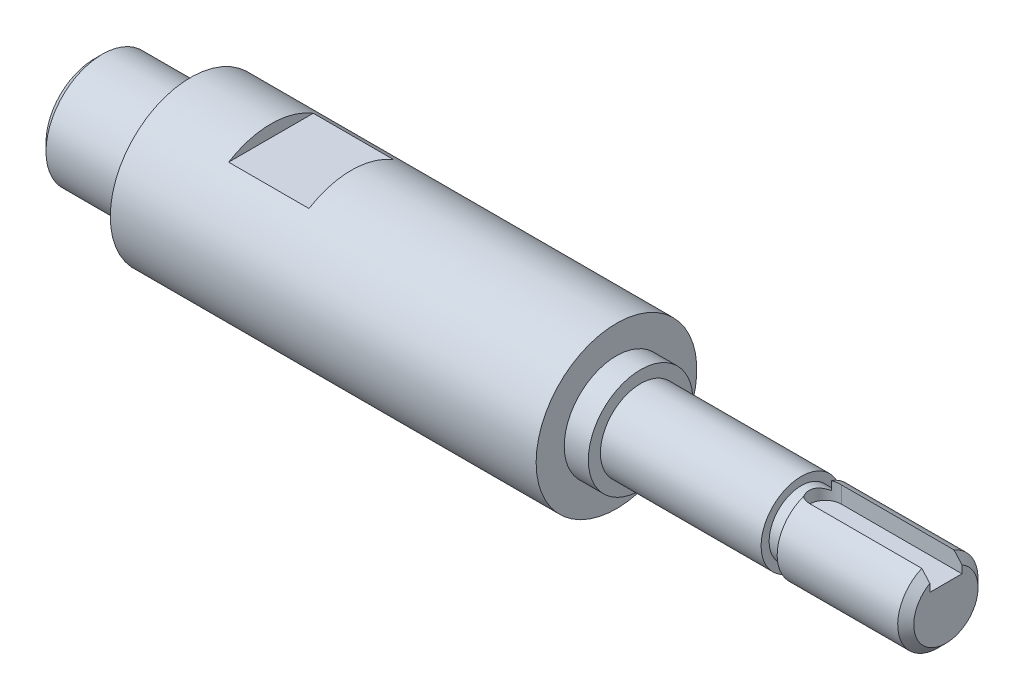
ISO-10303-21;
HEADER;
FILE_DESCRIPTION(('STEP AP214'),'2;1');
FILE_NAME('part.step','',(''),(''),'','','');
FILE_SCHEMA(('AUTOMOTIVE_DESIGN { 1 0 10303 214 1 1 1 1 }'));
ENDSEC;
DATA;
#1=APPLICATION_CONTEXT('core data for automotive mechanical design processes');
#2=APPLICATION_PROTOCOL_DEFINITION('international standard','automotive_design',2000,#1);
#3=PRODUCT_CONTEXT('',#1,'mechanical');
#4=PRODUCT('Part','Part','',(#3));
#5=PRODUCT_RELATED_PRODUCT_CATEGORY('part','',(#4));
#6=PRODUCT_DEFINITION_FORMATION('','',#4);
#7=PRODUCT_DEFINITION_CONTEXT('part definition',#1,'design');
#8=PRODUCT_DEFINITION('design','',#6,#7);
#9=PRODUCT_DEFINITION_SHAPE('','',#8);
#10=(LENGTH_UNIT() NAMED_UNIT(*) SI_UNIT(.MILLI.,.METRE.));
#11=(NAMED_UNIT(*) PLANE_ANGLE_UNIT() SI_UNIT($,.RADIAN.));
#12=(NAMED_UNIT(*) SI_UNIT($,.STERADIAN.) SOLID_ANGLE_UNIT());
#13=UNCERTAINTY_MEASURE_WITH_UNIT(LENGTH_MEASURE(1.E-05),#10,'distance_accuracy_value','');
#14=(GEOMETRIC_REPRESENTATION_CONTEXT(3) GLOBAL_UNCERTAINTY_ASSIGNED_CONTEXT((#13)) GLOBAL_UNIT_ASSIGNED_CONTEXT((#10,
#11,#12)) REPRESENTATION_CONTEXT('',''));
#15=CARTESIAN_POINT('',(0.,0.,0.));
#16=DIRECTION('',(0.,0.,1.));
#17=DIRECTION('',(1.,0.,0.));
#18=AXIS2_PLACEMENT_3D('',#15,#16,#17);
#19=CARTESIAN_POINT('',(-42.5248346383296,0.,0.));
#20=DIRECTION('',(1.,0.,0.));
#21=DIRECTION('',(0.,0.,-1.));
#22=AXIS2_PLACEMENT_3D('',#19,#20,#21);
#23=PLANE('',#22);
#24=CARTESIAN_POINT('',(-42.5248346383296,0.,0.));
#25=DIRECTION('',(1.,0.,0.));
#26=DIRECTION('',(0.,0.,-1.));
#27=AXIS2_PLACEMENT_3D('',#24,#25,#26);
#28=CIRCLE('',#27,6.00000000000002);
#29=CARTESIAN_POINT('',(-42.5248346383296,0.,-6.00000000000002));
#30=VERTEX_POINT('',#29);
#31=EDGE_CURVE('E259',#30,#30,#28,.F.);
#32=ORIENTED_EDGE('',*,*,#31,.T.);
#33=EDGE_LOOP('',(#32));
#34=FACE_BOUND('',#33,.T.);
#35=ADVANCED_FACE('F32',(#34),#23,.F.);
#36=CARTESIAN_POINT('',(-49.0671168903803,0.,0.));
#37=DIRECTION('',(-1.,0.,0.));
#38=DIRECTION('',(0.,0.,1.));
#39=AXIS2_PLACEMENT_3D('',#36,#37,#38);
#40=CYLINDRICAL_SURFACE('',#39,7.);
#41=CARTESIAN_POINT('',(-41.5248346383296,0.,0.));
#42=DIRECTION('',(1.,0.,0.));
#43=DIRECTION('',(0.,0.,-1.));
#44=AXIS2_PLACEMENT_3D('',#41,#42,#43);
#45=CIRCLE('',#44,7.);
#46=CARTESIAN_POINT('',(-41.5248346383296,0.,-7.));
#47=VERTEX_POINT('',#46);
#48=EDGE_CURVE('E256',#47,#47,#45,.T.);
#49=ORIENTED_EDGE('',*,*,#48,.T.);
#50=EDGE_LOOP('',(#49));
#51=FACE_BOUND('',#50,.T.);
#52=CARTESIAN_POINT('',(-32.5248346383296,0.,0.));
#53=DIRECTION('',(-1.,0.,0.));
#54=DIRECTION('',(0.,0.,1.));
#55=AXIS2_PLACEMENT_3D('',#52,#53,#54);
#56=CIRCLE('',#55,7.);
#57=CARTESIAN_POINT('',(-32.5248346383296,0.,7.));
#58=VERTEX_POINT('',#57);
#59=EDGE_CURVE('E265',#58,#58,#56,.T.);
#60=ORIENTED_EDGE('',*,*,#59,.T.);
#61=EDGE_LOOP('',(#60));
#62=FACE_BOUND('',#61,.T.);
#63=ADVANCED_FACE('F211',(#51,#62),#40,.T.);
#64=CARTESIAN_POINT('',(-32.5248346383296,7.,0.));
#65=DIRECTION('',(-1.,0.,0.));
#66=DIRECTION('',(0.,0.,1.));
#67=AXIS2_PLACEMENT_3D('',#64,#65,#66);
#68=PLANE('',#67);
#69=ORIENTED_EDGE('',*,*,#59,.F.);
#70=EDGE_LOOP('',(#69));
#71=FACE_BOUND('',#70,.T.);
#72=CARTESIAN_POINT('',(-32.5248346383296,0.,0.));
#73=DIRECTION('',(-1.,0.,0.));
#74=DIRECTION('',(0.,0.,1.));
#75=AXIS2_PLACEMENT_3D('',#72,#73,#74);
#76=CIRCLE('',#75,6.);
#77=CARTESIAN_POINT('',(-32.5248346383296,0.,6.));
#78=VERTEX_POINT('',#77);
#79=EDGE_CURVE('E268',#78,#78,#76,.T.);
#80=ORIENTED_EDGE('',*,*,#79,.T.);
#81=EDGE_LOOP('',(#80));
#82=FACE_BOUND('',#81,.T.);
#83=ADVANCED_FACE('F217',(#71,#82),#68,.F.);
#84=CARTESIAN_POINT('',(-49.0671168903803,0.,0.));
#85=DIRECTION('',(-1.,0.,0.));
#86=DIRECTION('',(0.,0.,1.));
#87=AXIS2_PLACEMENT_3D('',#84,#85,#86);
#88=CYLINDRICAL_SURFACE('',#87,6.);
#89=ORIENTED_EDGE('',*,*,#79,.F.);
#90=EDGE_LOOP('',(#89));
#91=FACE_BOUND('',#90,.T.);
#92=CARTESIAN_POINT('',(-30.5248346383296,0.,0.));
#93=DIRECTION('',(-1.,0.,0.));
#94=DIRECTION('',(0.,0.,1.));
#95=AXIS2_PLACEMENT_3D('',#92,#93,#94);
#96=CIRCLE('',#95,6.);
#97=CARTESIAN_POINT('',(-30.5248346383296,0.,6.));
#98=VERTEX_POINT('',#97);
#99=EDGE_CURVE('E271',#98,#98,#96,.T.);
#100=ORIENTED_EDGE('',*,*,#99,.T.);
#101=EDGE_LOOP('',(#100));
#102=FACE_BOUND('',#101,.T.);
#103=ADVANCED_FACE('F532',(#91,#102),#88,.T.);
#104=CARTESIAN_POINT('',(-30.5248346383296,6.,0.));
#105=DIRECTION('',(1.,0.,0.));
#106=DIRECTION('',(0.,0.,-1.));
#107=AXIS2_PLACEMENT_3D('',#104,#105,#106);
#108=PLANE('',#107);
#109=ORIENTED_EDGE('',*,*,#99,.F.);
#110=EDGE_LOOP('',(#109));
#111=FACE_BOUND('',#110,.T.);
#112=CARTESIAN_POINT('',(-30.5248346383296,0.,0.));
#113=DIRECTION('',(-1.,0.,0.));
#114=DIRECTION('',(0.,0.,1.));
#115=AXIS2_PLACEMENT_3D('',#112,#113,#114);
#116=CIRCLE('',#115,10.);
#117=CARTESIAN_POINT('',(-30.5248346383296,0.,10.));
#118=VERTEX_POINT('',#117);
#119=EDGE_CURVE('E274',#118,#118,#116,.T.);
#120=ORIENTED_EDGE('',*,*,#119,.T.);
#121=EDGE_LOOP('',(#120));
#122=FACE_BOUND('',#121,.T.);
#123=ADVANCED_FACE('F344',(#111,#122),#108,.F.);
#124=CARTESIAN_POINT('',(-49.0671168903803,0.,0.));
#125=DIRECTION('',(-1.,0.,0.));
#126=DIRECTION('',(0.,0.,1.));
#127=AXIS2_PLACEMENT_3D('',#124,#125,#126);
#128=CYLINDRICAL_SURFACE('',#127,10.);
#129=DIRECTION('',(-1.,0.,0.));
#130=VECTOR('',#129,1.);
#131=CARTESIAN_POINT('',(-49.0671168903803,-8.5,-5.26782687642637));
#132=LINE('',#131,#130);
#133=CARTESIAN_POINT('',(-10.5248346383296,-8.5,-5.26782687642637));
#134=VERTEX_POINT('',#133);
#135=CARTESIAN_POINT('',(-20.5248346383296,-8.5,-5.26782687642637));
#136=VERTEX_POINT('',#135);
#137=EDGE_CURVE('E235',#134,#136,#132,.T.);
#138=ORIENTED_EDGE('',*,*,#137,.T.);
#139=CARTESIAN_POINT('',(-20.5248346383296,0.,0.));
#140=DIRECTION('',(-1.,0.,0.));
#141=DIRECTION('',(0.,0.,1.));
#142=AXIS2_PLACEMENT_3D('',#139,#140,#141);
#143=CIRCLE('',#142,10.);
#144=CARTESIAN_POINT('',(-20.5248346383296,-8.5,5.26782687642637));
#145=VERTEX_POINT('',#144);
#146=EDGE_CURVE('E232',#136,#145,#143,.T.);
#147=ORIENTED_EDGE('',*,*,#146,.T.);
#148=DIRECTION('',(-1.,0.,0.));
#149=VECTOR('',#148,1.);
#150=CARTESIAN_POINT('',(-49.0671168903803,-8.5,5.26782687642637));
#151=LINE('',#150,#149);
#152=CARTESIAN_POINT('',(-10.5248346383296,-8.5,5.26782687642637));
#153=VERTEX_POINT('',#152);
#154=EDGE_CURVE('E238',#145,#153,#151,.F.);
#155=ORIENTED_EDGE('',*,*,#154,.T.);
#156=CARTESIAN_POINT('',(-10.5248346383296,0.,0.));
#157=DIRECTION('',(1.,0.,0.));
#158=DIRECTION('',(0.,1.,0.));
#159=AXIS2_PLACEMENT_3D('',#156,#157,#158);
#160=CIRCLE('',#159,10.);
#161=EDGE_CURVE('E241',#153,#134,#160,.T.);
#162=ORIENTED_EDGE('',*,*,#161,.T.);
#163=EDGE_LOOP('',(#138,#147,#155,#162));
#164=FACE_BOUND('',#163,.T.);
#165=CARTESIAN_POINT('',(-10.5248346383296,0.,0.));
#166=DIRECTION('',(1.,0.,0.));
#167=DIRECTION('',(0.,1.,0.));
#168=AXIS2_PLACEMENT_3D('',#165,#166,#167);
#169=CIRCLE('',#168,10.);
#170=CARTESIAN_POINT('',(-10.5248346383296,8.5,-5.26782687642637));
#171=VERTEX_POINT('',#170);
#172=CARTESIAN_POINT('',(-10.5248346383296,8.5,5.26782687642637));
#173=VERTEX_POINT('',#172);
#174=EDGE_CURVE('E250',#171,#173,#169,.T.);
#175=ORIENTED_EDGE('',*,*,#174,.T.);
#176=DIRECTION('',(-1.,0.,0.));
#177=VECTOR('',#176,1.);
#178=CARTESIAN_POINT('',(-49.0671168903803,8.5,5.26782687642637));
#179=LINE('',#178,#177);
#180=CARTESIAN_POINT('',(-20.5248346383296,8.5,5.26782687642637));
#181=VERTEX_POINT('',#180);
#182=EDGE_CURVE('E244',#173,#181,#179,.T.);
#183=ORIENTED_EDGE('',*,*,#182,.T.);
#184=CARTESIAN_POINT('',(-20.5248346383296,0.,0.));
#185=DIRECTION('',(-1.,0.,0.));
#186=DIRECTION('',(0.,0.,1.));
#187=AXIS2_PLACEMENT_3D('',#184,#185,#186);
#188=CIRCLE('',#187,10.);
#189=CARTESIAN_POINT('',(-20.5248346383296,8.5,-5.26782687642637));
#190=VERTEX_POINT('',#189);
#191=EDGE_CURVE('E247',#181,#190,#188,.T.);
#192=ORIENTED_EDGE('',*,*,#191,.T.);
#193=DIRECTION('',(-1.,0.,0.));
#194=VECTOR('',#193,1.);
#195=CARTESIAN_POINT('',(-49.0671168903803,8.5,-5.26782687642637));
#196=LINE('',#195,#194);
#197=EDGE_CURVE('E253',#190,#171,#196,.F.);
#198=ORIENTED_EDGE('',*,*,#197,.T.);
#199=EDGE_LOOP('',(#175,#183,#192,#198));
#200=FACE_BOUND('',#199,.T.);
#201=ORIENTED_EDGE('',*,*,#119,.F.);
#202=EDGE_LOOP('',(#201));
#203=FACE_BOUND('',#202,.T.);
#204=CARTESIAN_POINT('',(22.4751653616704,0.,0.));
#205=DIRECTION('',(-1.,0.,0.));
#206=DIRECTION('',(0.,0.,1.));
#207=AXIS2_PLACEMENT_3D('',#204,#205,#206);
#208=CIRCLE('',#207,10.);
#209=CARTESIAN_POINT('',(22.4751653616704,0.,10.));
#210=VERTEX_POINT('',#209);
#211=EDGE_CURVE('E277',#210,#210,#208,.T.);
#212=ORIENTED_EDGE('',*,*,#211,.T.);
#213=EDGE_LOOP('',(#212));
#214=FACE_BOUND('',#213,.T.);
#215=ADVANCED_FACE('F314',(#164,#200,#203,#214),#128,.T.);
#216=CARTESIAN_POINT('',(22.4751653616704,10.,0.));
#217=DIRECTION('',(-1.,0.,0.));
#218=DIRECTION('',(0.,0.,1.));
#219=AXIS2_PLACEMENT_3D('',#216,#217,#218);
#220=PLANE('',#219);
#221=ORIENTED_EDGE('',*,*,#211,.F.);
#222=EDGE_LOOP('',(#221));
#223=FACE_BOUND('',#222,.T.);
#224=CARTESIAN_POINT('',(22.4751653616704,0.,0.));
#225=DIRECTION('',(-1.,0.,0.));
#226=DIRECTION('',(0.,0.,1.));
#227=AXIS2_PLACEMENT_3D('',#224,#225,#226);
#228=CIRCLE('',#227,6.5);
#229=CARTESIAN_POINT('',(22.4751653616704,0.,6.5));
#230=VERTEX_POINT('',#229);
#231=EDGE_CURVE('E280',#230,#230,#228,.T.);
#232=ORIENTED_EDGE('',*,*,#231,.T.);
#233=EDGE_LOOP('',(#232));
#234=FACE_BOUND('',#233,.T.);
#235=ADVANCED_FACE('F343',(#223,#234),#220,.F.);
#236=CARTESIAN_POINT('',(-49.0671168903803,0.,0.));
#237=DIRECTION('',(-1.,0.,0.));
#238=DIRECTION('',(0.,0.,1.));
#239=AXIS2_PLACEMENT_3D('',#236,#237,#238);
#240=CYLINDRICAL_SURFACE('',#239,6.5);
#241=ORIENTED_EDGE('',*,*,#231,.F.);
#242=EDGE_LOOP('',(#241));
#243=FACE_BOUND('',#242,.T.);
#244=CARTESIAN_POINT('',(25.4751653616704,0.,0.));
#245=DIRECTION('',(-1.,0.,0.));
#246=DIRECTION('',(0.,0.,1.));
#247=AXIS2_PLACEMENT_3D('',#244,#245,#246);
#248=CIRCLE('',#247,6.5);
#249=CARTESIAN_POINT('',(25.4751653616704,0.,6.5));
#250=VERTEX_POINT('',#249);
#251=EDGE_CURVE('E283',#250,#250,#248,.T.);
#252=ORIENTED_EDGE('',*,*,#251,.T.);
#253=EDGE_LOOP('',(#252));
#254=FACE_BOUND('',#253,.T.);
#255=ADVANCED_FACE('F352',(#243,#254),#240,.T.);
#256=CARTESIAN_POINT('',(25.4751653616704,6.5,0.));
#257=DIRECTION('',(-1.,0.,0.));
#258=DIRECTION('',(0.,0.,1.));
#259=AXIS2_PLACEMENT_3D('',#256,#257,#258);
#260=PLANE('',#259);
#261=ORIENTED_EDGE('',*,*,#251,.F.);
#262=EDGE_LOOP('',(#261));
#263=FACE_BOUND('',#262,.T.);
#264=CARTESIAN_POINT('',(25.4751653616704,0.,0.));
#265=DIRECTION('',(-1.,0.,0.));
#266=DIRECTION('',(0.,0.,1.));
#267=AXIS2_PLACEMENT_3D('',#264,#265,#266);
#268=CIRCLE('',#267,5.);
#269=CARTESIAN_POINT('',(25.4751653616704,0.,5.));
#270=VERTEX_POINT('',#269);
#271=EDGE_CURVE('E286',#270,#270,#268,.T.);
#272=ORIENTED_EDGE('',*,*,#271,.T.);
#273=EDGE_LOOP('',(#272));
#274=FACE_BOUND('',#273,.T.);
#275=ADVANCED_FACE('F358',(#263,#274),#260,.F.);
#276=CARTESIAN_POINT('',(-49.0671168903803,0.,0.));
#277=DIRECTION('',(-1.,0.,0.));
#278=DIRECTION('',(0.,0.,1.));
#279=AXIS2_PLACEMENT_3D('',#276,#277,#278);
#280=CYLINDRICAL_SURFACE('',#279,5.);
#281=ORIENTED_EDGE('',*,*,#271,.F.);
#282=EDGE_LOOP('',(#281));
#283=FACE_BOUND('',#282,.T.);
#284=CARTESIAN_POINT('',(45.4751653616704,0.,0.));
#285=DIRECTION('',(-1.,0.,0.));
#286=DIRECTION('',(0.,0.,1.));
#287=AXIS2_PLACEMENT_3D('',#284,#285,#286);
#288=CIRCLE('',#287,5.);
#289=CARTESIAN_POINT('',(45.4751653616704,0.,5.));
#290=VERTEX_POINT('',#289);
#291=EDGE_CURVE('E289',#290,#290,#288,.T.);
#292=ORIENTED_EDGE('',*,*,#291,.T.);
#293=EDGE_LOOP('',(#292));
#294=FACE_BOUND('',#293,.T.);
#295=ADVANCED_FACE('F364',(#283,#294),#280,.T.);
#296=CARTESIAN_POINT('',(45.4751653616704,5.,0.));
#297=DIRECTION('',(-1.,0.,0.));
#298=DIRECTION('',(0.,0.,1.));
#299=AXIS2_PLACEMENT_3D('',#296,#297,#298);
#300=PLANE('',#299);
#301=ORIENTED_EDGE('',*,*,#291,.F.);
#302=EDGE_LOOP('',(#301));
#303=FACE_BOUND('',#302,.T.);
#304=CARTESIAN_POINT('',(45.4751653616704,0.,0.));
#305=DIRECTION('',(-1.,0.,0.));
#306=DIRECTION('',(0.,0.,1.));
#307=AXIS2_PLACEMENT_3D('',#304,#305,#306);
#308=CIRCLE('',#307,4.);
#309=CARTESIAN_POINT('',(45.4751653616704,0.,4.));
#310=VERTEX_POINT('',#309);
#311=EDGE_CURVE('E292',#310,#310,#308,.T.);
#312=ORIENTED_EDGE('',*,*,#311,.T.);
#313=EDGE_LOOP('',(#312));
#314=FACE_BOUND('',#313,.T.);
#315=ADVANCED_FACE('F207',(#303,#314),#300,.F.);
#316=CARTESIAN_POINT('',(-49.0671168903803,0.,0.));
#317=DIRECTION('',(-1.,0.,0.));
#318=DIRECTION('',(0.,0.,1.));
#319=AXIS2_PLACEMENT_3D('',#316,#317,#318);
#320=CYLINDRICAL_SURFACE('',#319,4.);
#321=ORIENTED_EDGE('',*,*,#311,.F.);
#322=EDGE_LOOP('',(#321));
#323=FACE_BOUND('',#322,.T.);
#324=CARTESIAN_POINT('',(47.4751653616704,0.,0.));
#325=DIRECTION('',(-1.,0.,0.));
#326=DIRECTION('',(0.,0.,1.));
#327=AXIS2_PLACEMENT_3D('',#324,#325,#326);
#328=CIRCLE('',#327,4.);
#329=CARTESIAN_POINT('',(47.4751653616704,3.60555127546399,-1.73205080756887));
#330=VERTEX_POINT('',#329);
#331=CARTESIAN_POINT('',(47.4751653616704,3.60555127546399,1.73205080756887));
#332=VERTEX_POINT('',#331);
#333=EDGE_CURVE('E295',#330,#332,#328,.T.);
#334=ORIENTED_EDGE('',*,*,#333,.T.);
#335=CARTESIAN_POINT('',(47.4751653616704,3.60555127546399,1.73205080756887));
#336=CARTESIAN_POINT('',(47.3750103685073,3.63336854411531,1.67421550653928));
#337=CARTESIAN_POINT('',(47.2803969984164,3.66343104134973,1.60801806150308));
#338=CARTESIAN_POINT('',(47.103860066441,3.72471713685452,1.46041250188742));
#339=CARTESIAN_POINT('',(47.0219703537728,3.75594356722937,1.37896504335853));
#340=CARTESIAN_POINT('',(46.8729904426494,3.81606312926052,1.20264581158777));
#341=CARTESIAN_POINT('',(46.8059082769721,3.84495498910143,1.10776679759362));
#342=CARTESIAN_POINT('',(46.688744294338,3.89724828322799,0.906752643005459));
#343=CARTESIAN_POINT('',(46.6386411802763,3.92065658416236,0.800631824263398));
#344=CARTESIAN_POINT('',(46.5591400628849,3.95853280747319,0.584429936901195));
#345=CARTESIAN_POINT('',(46.5289774331336,3.9733279107263,0.474689582013239));
#346=CARTESIAN_POINT('',(46.487704139601,3.99370388633774,0.250847724928146));
#347=CARTESIAN_POINT('',(46.4765836000015,3.99928953494885,0.136748514778659));
#348=CARTESIAN_POINT('',(46.4741264885479,4.00052065464019,-0.0805829717638436));
#349=CARTESIAN_POINT('',(46.4809737656783,3.99707864149346,-0.183794668183014));
#350=CARTESIAN_POINT('',(46.5103464237798,3.98250558376945,-0.387375703667239));
#351=CARTESIAN_POINT('',(46.5328694488868,3.97137569458334,-0.48774546747982));
#352=CARTESIAN_POINT('',(46.5922709605194,3.94266756677139,-0.681835741080993));
#353=CARTESIAN_POINT('',(46.6289818098781,3.92516476257827,-0.775619318008778));
#354=CARTESIAN_POINT('',(46.7155085466758,3.88521837494264,-0.955829572574558));
#355=CARTESIAN_POINT('',(46.7653335571682,3.86277135376557,-1.04225107306333));
#356=CARTESIAN_POINT('',(46.8814618541018,3.81273036601441,-1.21312616844123));
#357=CARTESIAN_POINT('',(46.9488047386196,3.78486126684487,-1.29679031794168));
#358=CARTESIAN_POINT('',(47.0957014568138,3.7280486995122,-1.45206104996184));
#359=CARTESIAN_POINT('',(47.1752424717932,3.69910638309688,-1.52368012657085));
#360=CARTESIAN_POINT('',(47.2942856101032,3.65970438509363,-1.61473862858372));
#361=CARTESIAN_POINT('',(47.3293523125429,3.64852280190502,-1.63980998945807));
#362=CARTESIAN_POINT('',(47.4010751031761,3.62663841211857,-1.68765591109096));
#363=CARTESIAN_POINT('',(47.4377285589571,3.61593486820076,-1.71043408205803));
#364=CARTESIAN_POINT('',(47.4751653616704,3.60555127546399,-1.73205080756888));
#365=B_SPLINE_CURVE_WITH_KNOTS('',3,(#335,#336,#337,#338,#339,#340,#341,#342,#343,#344,#345,
#346,#347,#348,#349,#350,#351,#352,#353,#354,#355,#356,#357,#358,#359,#360,#361,#362,#363,#364),
.UNSPECIFIED.,.F.,.F.,(4,2,2,2,2,2,2,2,2,2,2,2,2,2,4),(0.,0.356334863049345,0.713602038512693,
1.07106255006444,1.42807301890542,1.77044734451533,2.11264405034702,2.4216139073866,
2.73053734023873,3.03591707079167,3.34150980720075,3.67303714027957,4.00421843755681,
4.13774778666693,4.27106351827409),.UNSPECIFIED.);
#366=EDGE_CURVE('E157',#332,#330,#365,.T.);
#367=ORIENTED_EDGE('',*,*,#366,.T.);
#368=EDGE_LOOP('',(#334,#367));
#369=FACE_BOUND('',#368,.T.);
#370=ADVANCED_FACE('F166',(#323,#369),#320,.T.);
#371=CARTESIAN_POINT('',(47.4751653616704,4.,0.));
#372=DIRECTION('',(1.,0.,0.));
#373=DIRECTION('',(0.,0.,-1.));
#374=AXIS2_PLACEMENT_3D('',#371,#372,#373);
#375=PLANE('',#374);
#376=ORIENTED_EDGE('',*,*,#333,.F.);
#377=DIRECTION('',(0.,1.,0.));
#378=VECTOR('',#377,1.);
#379=CARTESIAN_POINT('',(47.4751653616704,2.5,-1.73205080756887));
#380=LINE('',#379,#378);
#381=CARTESIAN_POINT('',(47.4751653616704,4.69041575982343,-1.73205080756887));
#382=VERTEX_POINT('',#381);
#383=EDGE_CURVE('E164',#330,#382,#380,.T.);
#384=ORIENTED_EDGE('',*,*,#383,.T.);
#385=CARTESIAN_POINT('',(47.4751653616704,0.,0.));
#386=DIRECTION('',(-1.,0.,0.));
#387=DIRECTION('',(0.,0.,1.));
#388=AXIS2_PLACEMENT_3D('',#385,#386,#387);
#389=CIRCLE('',#388,5.);
#390=CARTESIAN_POINT('',(47.4751653616704,4.69041575982343,1.73205080756887));
#391=VERTEX_POINT('',#390);
#392=EDGE_CURVE('E298',#382,#391,#389,.T.);
#393=ORIENTED_EDGE('',*,*,#392,.T.);
#394=DIRECTION('',(0.,1.,0.));
#395=VECTOR('',#394,1.);
#396=CARTESIAN_POINT('',(47.4751653616704,2.5,1.73205080756887));
#397=LINE('',#396,#395);
#398=EDGE_CURVE('E154',#391,#332,#397,.F.);
#399=ORIENTED_EDGE('',*,*,#398,.T.);
#400=EDGE_LOOP('',(#376,#384,#393,#399));
#401=FACE_BOUND('',#400,.T.);
#402=ADVANCED_FACE('F198',(#401),#375,.F.);
#403=CARTESIAN_POINT('',(-49.0671168903803,0.,0.));
#404=DIRECTION('',(-1.,0.,0.));
#405=DIRECTION('',(0.,0.,1.));
#406=AXIS2_PLACEMENT_3D('',#403,#404,#405);
#407=CYLINDRICAL_SURFACE('',#406,5.);
#408=CARTESIAN_POINT('',(62.4751653616704,0.,0.));
#409=DIRECTION('',(-1.,0.,0.));
#410=DIRECTION('',(0.,0.,1.));
#411=AXIS2_PLACEMENT_3D('',#408,#409,#410);
#412=CIRCLE('',#411,5.);
#413=CARTESIAN_POINT('',(62.4751653616703,4.58257569495588,-2.));
#414=VERTEX_POINT('',#413);
#415=CARTESIAN_POINT('',(62.4751653616703,4.58257569495588,2.));
#416=VERTEX_POINT('',#415);
#417=EDGE_CURVE('E262',#414,#416,#412,.T.);
#418=ORIENTED_EDGE('',*,*,#417,.T.);
#419=DIRECTION('',(-1.,0.,0.));
#420=VECTOR('',#419,1.);
#421=CARTESIAN_POINT('',(-49.0671168903803,4.58257569495585,1.99999999999998));
#422=LINE('',#421,#420);
#423=CARTESIAN_POINT('',(48.4751653616704,4.58257569495584,2.));
#424=VERTEX_POINT('',#423);
#425=EDGE_CURVE('E150',#416,#424,#422,.T.);
#426=ORIENTED_EDGE('',*,*,#425,.T.);
#427=CARTESIAN_POINT('',(48.4751653616704,4.58257569495584,2.));
#428=CARTESIAN_POINT('',(48.4208608162929,4.5825639953333,2.00000876206649));
#429=CARTESIAN_POINT('',(48.3665609237382,4.58354061673084,1.99778864366212));
#430=CARTESIAN_POINT('',(48.2583934483385,4.58738462495646,1.98895567126682));
#431=CARTESIAN_POINT('',(48.2045258091391,4.59025176111986,1.98234339963371));
#432=CARTESIAN_POINT('',(48.0988339643383,4.59770613629191,1.96498860598102));
#433=CARTESIAN_POINT('',(48.0469910532124,4.60225321548245,1.95434237646416));
#434=CARTESIAN_POINT('',(47.9444794785598,4.61291975473362,1.92903078779727));
#435=CARTESIAN_POINT('',(47.893810531444,4.61903883064439,1.91436641050643));
#436=CARTESIAN_POINT('',(47.78004045912,4.63456666171241,1.87651904787313));
#437=CARTESIAN_POINT('',(47.7174078485079,4.6444169766245,1.85210101282848));
#438=CARTESIAN_POINT('',(47.5942536959457,4.66607360666002,1.79683920540455));
#439=CARTESIAN_POINT('',(47.5337769713418,4.67790665183955,1.76590589009467));
#440=CARTESIAN_POINT('',(47.4751653616704,4.69041575982343,1.73205080756887));
#441=B_SPLINE_CURVE_WITH_KNOTS('',3,(#427,#428,#429,#430,#431,#432,#433,#434,#435,#436,#437,
#438,#439,#440),.UNSPECIFIED.,.F.,.F.,(4,2,2,2,2,2,4),(0.,0.162852314190644,0.325683040019503,
0.484849544725888,0.643977190745887,0.847430739193429,1.05388792899364),.UNSPECIFIED.);
#442=EDGE_CURVE('E11',#424,#391,#441,.T.);
#443=ORIENTED_EDGE('',*,*,#442,.T.);
#444=ORIENTED_EDGE('',*,*,#392,.F.);
#445=CARTESIAN_POINT('',(47.4751653616704,4.69041575982343,-1.73205080756887));
#446=CARTESIAN_POINT('',(47.521444547506,4.68054920180843,-1.75876578955475));
#447=CARTESIAN_POINT('',(47.5688364737881,4.67110007132911,-1.78365650863548));
#448=CARTESIAN_POINT('',(47.6656595301554,4.65328134436455,-1.82963994017423));
#449=CARTESIAN_POINT('',(47.7150919247594,4.64491243098081,-1.8507302526589));
#450=CARTESIAN_POINT('',(47.8636502862292,4.62218337115932,-1.90710673090694));
#451=CARTESIAN_POINT('',(47.9652962953546,4.60970154401622,-1.93680044185868));
#452=CARTESIAN_POINT('',(48.1349832064461,4.59471116298902,-1.97201741298893));
#453=CARTESIAN_POINT('',(48.2018965312733,4.59022860317734,-1.98239734040735));
#454=CARTESIAN_POINT('',(48.3375684211681,4.58412740973517,-1.99644552645108));
#455=CARTESIAN_POINT('',(48.4063396092008,4.5825527461654,-2.00001076848956));
#456=CARTESIAN_POINT('',(48.4751653616704,4.58257569495584,-2.));
#457=B_SPLINE_CURVE_WITH_KNOTS('',3,(#445,#446,#447,#448,#449,#450,#451,#452,#453,#454,#455,
#456),.UNSPECIFIED.,.F.,.F.,(4,2,2,2,2,4),(0.,0.162921271260359,0.325945070178591,
0.644121500422125,0.847337056294375,1.05360102117922),.UNSPECIFIED.);
#458=CARTESIAN_POINT('',(48.4751653616704,4.58257569495585,-2.));
#459=VERTEX_POINT('',#458);
#460=EDGE_CURVE('E45',#382,#459,#457,.T.);
#461=ORIENTED_EDGE('',*,*,#460,.T.);
#462=DIRECTION('',(-1.,0.,0.));
#463=VECTOR('',#462,1.);
#464=CARTESIAN_POINT('',(-49.0671168903803,4.58257569495585,-1.99999999999998));
#465=LINE('',#464,#463);
#466=EDGE_CURVE('E147',#459,#414,#465,.F.);
#467=ORIENTED_EDGE('',*,*,#466,.T.);
#468=EDGE_LOOP('',(#418,#426,#443,#444,#461,#467));
#469=FACE_BOUND('',#468,.T.);
#470=ADVANCED_FACE('F194',(#469),#407,.T.);
#471=CARTESIAN_POINT('',(63.4751653616704,5.,0.));
#472=DIRECTION('',(-1.,0.,0.));
#473=DIRECTION('',(0.,0.,1.));
#474=AXIS2_PLACEMENT_3D('',#471,#472,#473);
#475=PLANE('',#474);
#476=DIRECTION('',(0.,0.,-1.));
#477=VECTOR('',#476,1.);
#478=CARTESIAN_POINT('',(63.4751653616704,2.5,-2.));
#479=LINE('',#478,#477);
#480=CARTESIAN_POINT('',(63.4751653616704,2.5,2.));
#481=VERTEX_POINT('',#480);
#482=CARTESIAN_POINT('',(63.4751653616704,2.5,-2.));
#483=VERTEX_POINT('',#482);
#484=EDGE_CURVE('E127',#481,#483,#479,.T.);
#485=ORIENTED_EDGE('',*,*,#484,.F.);
#486=DIRECTION('',(0.,1.,0.));
#487=VECTOR('',#486,1.);
#488=CARTESIAN_POINT('',(63.4751653616704,2.5,2.));
#489=LINE('',#488,#487);
#490=CARTESIAN_POINT('',(63.4751653616704,3.46410161513774,2.));
#491=VERTEX_POINT('',#490);
#492=EDGE_CURVE('E151',#481,#491,#489,.T.);
#493=ORIENTED_EDGE('',*,*,#492,.T.);
#494=CARTESIAN_POINT('',(63.4751653616704,0.,0.));
#495=DIRECTION('',(-1.,0.,0.));
#496=DIRECTION('',(0.,0.,1.));
#497=AXIS2_PLACEMENT_3D('',#494,#495,#496);
#498=CIRCLE('',#497,3.99999999999999);
#499=CARTESIAN_POINT('',(63.4751653616704,3.46410161513774,-2.));
#500=VERTEX_POINT('',#499);
#501=EDGE_CURVE('E140',#491,#500,#498,.F.);
#502=ORIENTED_EDGE('',*,*,#501,.T.);
#503=DIRECTION('',(0.,1.,0.));
#504=VECTOR('',#503,1.);
#505=CARTESIAN_POINT('',(63.4751653616704,2.5,-2.));
#506=LINE('',#505,#504);
#507=EDGE_CURVE('E52',#483,#500,#506,.T.);
#508=ORIENTED_EDGE('',*,*,#507,.F.);
#509=EDGE_LOOP('',(#485,#493,#502,#508));
#510=FACE_BOUND('',#509,.T.);
#511=ADVANCED_FACE('F138',(#510),#475,.F.);
#512=CARTESIAN_POINT('',(62.4751653616704,0.,0.));
#513=DIRECTION('',(-1.,0.,0.));
#514=DIRECTION('',(0.,0.,1.));
#515=AXIS2_PLACEMENT_3D('',#512,#513,#514);
#516=CONICAL_SURFACE('',#515,5.,0.785398163397446);
#517=CARTESIAN_POINT('',(59.5738189285701,7.64403528614741,2.));
#518=CARTESIAN_POINT('',(59.7293715971961,7.48323936625815,2.));
#519=CARTESIAN_POINT('',(59.8847688035972,7.32229264684007,2.));
#520=CARTESIAN_POINT('',(60.1951692609423,7.00001784510445,2.));
#521=CARTESIAN_POINT('',(60.3501725093585,6.83868976035249,2.));
#522=CARTESIAN_POINT('',(60.6597371660935,6.51553575032119,2.));
#523=CARTESIAN_POINT('',(60.8142984594542,6.35370971486206,2.));
#524=CARTESIAN_POINT('',(61.1228231900176,6.02948899953711,2.));
#525=CARTESIAN_POINT('',(61.2767866283249,5.86709432072294,2.));
#526=CARTESIAN_POINT('',(61.5863149687636,5.53909297908053,2.));
#527=CARTESIAN_POINT('',(61.741868178821,5.37347527460204,2.));
#528=CARTESIAN_POINT('',(62.05196362659,5.04129635543867,2.));
#529=CARTESIAN_POINT('',(62.2065058688193,4.8747351449763,2.));
#530=CARTESIAN_POINT('',(62.514236973166,4.54038398448662,2.));
#531=CARTESIAN_POINT('',(62.66742591512,4.37259410802584,2.));
#532=CARTESIAN_POINT('',(62.9719675234405,4.03535172445941,2.));
#533=CARTESIAN_POINT('',(63.1233201965625,3.86589922347464,2.));
#534=CARTESIAN_POINT('',(63.3734266687303,3.58150490813658,2.));
#535=CARTESIAN_POINT('',(63.4729096054335,3.46720501311768,2.));
#536=CARTESIAN_POINT('',(63.6703503288614,3.23729752659553,2.));
#537=CARTESIAN_POINT('',(63.7683081570953,3.12168997083156,2.));
#538=CARTESIAN_POINT('',(63.9617439672361,2.88933515783055,2.));
#539=CARTESIAN_POINT('',(64.0572314643665,2.77259584505813,2.));
#540=CARTESIAN_POINT('',(64.2455184794796,2.53686083541159,2.));
#541=CARTESIAN_POINT('',(64.3383166268035,2.41786403738016,2.));
#542=CARTESIAN_POINT('',(64.5207501992632,2.17599016152744,2.));
#543=CARTESIAN_POINT('',(64.6103551602504,2.05308999201208,2.));
#544=CARTESIAN_POINT('',(64.7836821891277,1.80338455618584,2.));
#545=CARTESIAN_POINT('',(64.8674122167143,1.67658492195867,2.));
#546=CARTESIAN_POINT('',(64.9866254452357,1.4817124186585,2.));
#547=CARTESIAN_POINT('',(65.0254489178725,1.41568891353058,2.));
#548=CARTESIAN_POINT('',(65.1001800852486,1.28204100039335,2.));
#549=CARTESIAN_POINT('',(65.1360890794226,1.21441732339189,2.));
#550=CARTESIAN_POINT('',(65.2044070150721,1.0769960922079,2.));
#551=CARTESIAN_POINT('',(65.2367985441046,1.00718974704244,2.));
#552=CARTESIAN_POINT('',(65.2968786055127,0.865463109435106,2.));
#553=CARTESIAN_POINT('',(65.3245595845189,0.793539634768511,2.));
#554=CARTESIAN_POINT('',(65.3493280832762,0.720544331884356,2.));
#555=B_SPLINE_CURVE_WITH_KNOTS('',3,(#517,#518,#519,#520,#521,#522,#523,#524,#525,#526,#527,
#528,#529,#530,#531,#532,#533,#534,#535,#536,#537,#538,#539,#540,#541,#542,#543,#544,#545,#546,
#547,#548,#549,#550,#551,#552,#553,#554),.UNSPECIFIED.,.F.,.F.,(4,2,2,2,2,2,2,2,2,2,2,2,2,2,2,2,
2,2,4),(0.,0.671169197199749,1.34234269037459,2.01367725008726,2.68501056888133,3.3666482727071,
4.04828292838573,4.72987709948731,5.41146876226271,5.86604882488451,6.32061649339136,
6.77304073782593,7.22569164903782,7.68188786429146,8.13745356156826,8.36717353450656,
8.59679051648656,8.8274968039273,9.05856961269508),.UNSPECIFIED.);
#556=EDGE_CURVE('E189',#416,#491,#555,.T.);
#557=ORIENTED_EDGE('',*,*,#556,.F.);
#558=ORIENTED_EDGE('',*,*,#417,.F.);
#559=CARTESIAN_POINT('',(59.5738189285701,7.64403528614741,-2.));
#560=CARTESIAN_POINT('',(59.7293715971961,7.48323936625815,-2.));
#561=CARTESIAN_POINT('',(59.8847688035972,7.32229264684007,-2.));
#562=CARTESIAN_POINT('',(60.1951692609423,7.00001784510445,-2.));
#563=CARTESIAN_POINT('',(60.3501725093585,6.83868976035249,-2.));
#564=CARTESIAN_POINT('',(60.6597371660935,6.51553575032119,-2.));
#565=CARTESIAN_POINT('',(60.8142984594542,6.35370971486206,-2.));
#566=CARTESIAN_POINT('',(61.1228231900176,6.02948899953711,-2.));
#567=CARTESIAN_POINT('',(61.2767866283249,5.86709432072294,-2.));
#568=CARTESIAN_POINT('',(61.5863149687636,5.53909297908053,-2.));
#569=CARTESIAN_POINT('',(61.741868178821,5.37347527460204,-2.));
#570=CARTESIAN_POINT('',(62.05196362659,5.04129635543867,-2.));
#571=CARTESIAN_POINT('',(62.2065058688193,4.8747351449763,-2.));
#572=CARTESIAN_POINT('',(62.514236973166,4.54038398448662,-2.));
#573=CARTESIAN_POINT('',(62.66742591512,4.37259410802584,-2.));
#574=CARTESIAN_POINT('',(62.9719675234405,4.03535172445941,-2.));
#575=CARTESIAN_POINT('',(63.1233201965625,3.86589922347464,-2.));
#576=CARTESIAN_POINT('',(63.3734266687303,3.58150490813658,-2.));
#577=CARTESIAN_POINT('',(63.4729096054335,3.46720501311768,-2.));
#578=CARTESIAN_POINT('',(63.6703503288614,3.23729752659553,-2.));
#579=CARTESIAN_POINT('',(63.7683081570953,3.12168997083156,-2.));
#580=CARTESIAN_POINT('',(63.9617439672361,2.88933515783055,-2.));
#581=CARTESIAN_POINT('',(64.0572314643665,2.77259584505813,-2.));
#582=CARTESIAN_POINT('',(64.2455184794796,2.53686083541159,-2.));
#583=CARTESIAN_POINT('',(64.3383166268035,2.41786403738016,-2.));
#584=CARTESIAN_POINT('',(64.5207501992632,2.17599016152744,-2.));
#585=CARTESIAN_POINT('',(64.6103551602504,2.05308999201208,-2.));
#586=CARTESIAN_POINT('',(64.7836821891277,1.80338455618584,-2.));
#587=CARTESIAN_POINT('',(64.8674122167143,1.67658492195867,-2.));
#588=CARTESIAN_POINT('',(64.9866254452357,1.4817124186585,-2.));
#589=CARTESIAN_POINT('',(65.0254489178725,1.41568891353058,-2.));
#590=CARTESIAN_POINT('',(65.1001800852486,1.28204100039335,-2.));
#591=CARTESIAN_POINT('',(65.1360890794226,1.21441732339189,-2.));
#592=CARTESIAN_POINT('',(65.2044070150721,1.0769960922079,-2.));
#593=CARTESIAN_POINT('',(65.2367985441046,1.00718974704244,-2.));
#594=CARTESIAN_POINT('',(65.2968786055127,0.865463109435106,-2.));
#595=CARTESIAN_POINT('',(65.3245595845189,0.793539634768511,-2.));
#596=CARTESIAN_POINT('',(65.3493280832762,0.720544331884356,-2.));
#597=B_SPLINE_CURVE_WITH_KNOTS('',3,(#559,#560,#561,#562,#563,#564,#565,#566,#567,#568,#569,
#570,#571,#572,#573,#574,#575,#576,#577,#578,#579,#580,#581,#582,#583,#584,#585,#586,#587,#588,
#589,#590,#591,#592,#593,#594,#595,#596),.UNSPECIFIED.,.F.,.F.,(4,2,2,2,2,2,2,2,2,2,2,2,2,2,2,2,
2,2,4),(0.,0.671169197199749,1.34234269037459,2.01367725008726,2.68501056888133,3.3666482727071,
4.04828292838573,4.72987709948731,5.41146876226271,5.86604882488451,6.32061649339136,
6.77304073782593,7.22569164903782,7.68188786429146,8.13745356156826,8.36717353450656,
8.59679051648656,8.8274968039273,9.05856961269508),.UNSPECIFIED.);
#598=EDGE_CURVE('E227',#500,#414,#597,.F.);
#599=ORIENTED_EDGE('',*,*,#598,.F.);
#600=ORIENTED_EDGE('',*,*,#501,.F.);
#601=EDGE_LOOP('',(#557,#558,#599,#600));
#602=FACE_BOUND('',#601,.T.);
#603=ADVANCED_FACE('F222',(#602),#516,.T.);
#604=CARTESIAN_POINT('',(-42.5248346383296,0.,0.));
#605=DIRECTION('',(1.,0.,0.));
#606=DIRECTION('',(0.,0.,-1.));
#607=AXIS2_PLACEMENT_3D('',#604,#605,#606);
#608=CONICAL_SURFACE('',#607,6.00000000000002,0.785398163397445);
#609=ORIENTED_EDGE('',*,*,#48,.F.);
#610=EDGE_LOOP('',(#609));
#611=FACE_BOUND('',#610,.T.);
#612=ORIENTED_EDGE('',*,*,#31,.F.);
#613=EDGE_LOOP('',(#612));
#614=FACE_BOUND('',#613,.T.);
#615=ADVANCED_FACE('F34',(#611,#614),#608,.T.);
#616=CARTESIAN_POINT('',(-20.5248346383296,8.5,-15.));
#617=DIRECTION('',(-1.,0.,0.));
#618=DIRECTION('',(0.,0.,1.));
#619=AXIS2_PLACEMENT_3D('',#616,#617,#618);
#620=PLANE('',#619);
#621=DIRECTION('',(0.,0.,1.));
#622=VECTOR('',#621,1.);
#623=CARTESIAN_POINT('',(-20.5248346383296,8.5,-15.));
#624=LINE('',#623,#622);
#625=EDGE_CURVE('E302',#190,#181,#624,.T.);
#626=ORIENTED_EDGE('',*,*,#625,.F.);
#627=ORIENTED_EDGE('',*,*,#191,.F.);
#628=EDGE_LOOP('',(#626,#627));
#629=FACE_BOUND('',#628,.T.);
#630=ADVANCED_FACE('F329',(#629),#620,.F.);
#631=CARTESIAN_POINT('',(-10.5248346383296,11.9733945404388,-15.));
#632=DIRECTION('',(1.,0.,0.));
#633=DIRECTION('',(0.,1.,0.));
#634=AXIS2_PLACEMENT_3D('',#631,#632,#633);
#635=PLANE('',#634);
#636=DIRECTION('',(0.,0.,1.));
#637=VECTOR('',#636,1.);
#638=CARTESIAN_POINT('',(-10.5248346383296,8.5,-15.));
#639=LINE('',#638,#637);
#640=EDGE_CURVE('E301',#171,#173,#639,.T.);
#641=ORIENTED_EDGE('',*,*,#640,.T.);
#642=ORIENTED_EDGE('',*,*,#174,.F.);
#643=EDGE_LOOP('',(#641,#642));
#644=FACE_BOUND('',#643,.T.);
#645=ADVANCED_FACE('F326',(#644),#635,.F.);
#646=CARTESIAN_POINT('',(-20.5248346383296,8.5,-15.));
#647=DIRECTION('',(0.,-1.,0.));
#648=DIRECTION('',(0.,0.,-1.));
#649=AXIS2_PLACEMENT_3D('',#646,#647,#648);
#650=PLANE('',#649);
#651=ORIENTED_EDGE('',*,*,#640,.F.);
#652=ORIENTED_EDGE('',*,*,#197,.F.);
#653=ORIENTED_EDGE('',*,*,#625,.T.);
#654=ORIENTED_EDGE('',*,*,#182,.F.);
#655=EDGE_LOOP('',(#651,#652,#653,#654));
#656=FACE_BOUND('',#655,.T.);
#657=ADVANCED_FACE('F323',(#656),#650,.F.);
#658=CARTESIAN_POINT('',(-20.5248346383296,-8.5,-15.));
#659=DIRECTION('',(-1.,0.,0.));
#660=DIRECTION('',(0.,0.,1.));
#661=AXIS2_PLACEMENT_3D('',#658,#659,#660);
#662=PLANE('',#661);
#663=DIRECTION('',(0.,0.,1.));
#664=VECTOR('',#663,1.);
#665=CARTESIAN_POINT('',(-20.5248346383296,-8.5,-15.));
#666=LINE('',#665,#664);
#667=EDGE_CURVE('E305',#136,#145,#666,.T.);
#668=ORIENTED_EDGE('',*,*,#667,.T.);
#669=ORIENTED_EDGE('',*,*,#146,.F.);
#670=EDGE_LOOP('',(#668,#669));
#671=FACE_BOUND('',#670,.T.);
#672=ADVANCED_FACE('F311',(#671),#662,.F.);
#673=CARTESIAN_POINT('',(-20.5248346383296,-8.5,-15.));
#674=DIRECTION('',(0.,1.,0.));
#675=DIRECTION('',(0.,0.,1.));
#676=AXIS2_PLACEMENT_3D('',#673,#674,#675);
#677=PLANE('',#676);
#678=DIRECTION('',(0.,0.,1.));
#679=VECTOR('',#678,1.);
#680=CARTESIAN_POINT('',(-10.5248346383296,-8.5,-15.));
#681=LINE('',#680,#679);
#682=EDGE_CURVE('E59',#134,#153,#681,.T.);
#683=ORIENTED_EDGE('',*,*,#682,.T.);
#684=ORIENTED_EDGE('',*,*,#154,.F.);
#685=ORIENTED_EDGE('',*,*,#667,.F.);
#686=ORIENTED_EDGE('',*,*,#137,.F.);
#687=EDGE_LOOP('',(#683,#684,#685,#686));
#688=FACE_BOUND('',#687,.T.);
#689=ADVANCED_FACE('F316',(#688),#677,.F.);
#690=CARTESIAN_POINT('',(-10.5248346383296,-11.7284852555586,-15.));
#691=DIRECTION('',(1.,0.,0.));
#692=DIRECTION('',(0.,1.,0.));
#693=AXIS2_PLACEMENT_3D('',#690,#691,#692);
#694=PLANE('',#693);
#695=ORIENTED_EDGE('',*,*,#682,.F.);
#696=ORIENTED_EDGE('',*,*,#161,.F.);
#697=EDGE_LOOP('',(#695,#696));
#698=FACE_BOUND('',#697,.T.);
#699=ADVANCED_FACE('F176',(#698),#694,.F.);
#700=CARTESIAN_POINT('',(48.4751653616704,2.5,0.));
#701=DIRECTION('',(0.,1.,0.));
#702=DIRECTION('',(0.,0.,1.));
#703=AXIS2_PLACEMENT_3D('',#700,#701,#702);
#704=CYLINDRICAL_SURFACE('',#703,2.);
#705=ORIENTED_EDGE('',*,*,#383,.F.);
#706=ORIENTED_EDGE('',*,*,#366,.F.);
#707=ORIENTED_EDGE('',*,*,#398,.F.);
#708=ORIENTED_EDGE('',*,*,#442,.F.);
#709=DIRECTION('',(0.,1.,0.));
#710=VECTOR('',#709,1.);
#711=CARTESIAN_POINT('',(48.4751653616704,2.5,2.));
#712=LINE('',#711,#710);
#713=CARTESIAN_POINT('',(48.4751653616704,2.5,2.));
#714=VERTEX_POINT('',#713);
#715=EDGE_CURVE('E142',#714,#424,#712,.T.);
#716=ORIENTED_EDGE('',*,*,#715,.F.);
#717=CARTESIAN_POINT('',(48.4751653616704,2.5,0.));
#718=DIRECTION('',(0.,1.,0.));
#719=DIRECTION('',(0.,0.,1.));
#720=AXIS2_PLACEMENT_3D('',#717,#718,#719);
#721=CIRCLE('',#720,2.);
#722=CARTESIAN_POINT('',(48.4751653616704,2.5,-2.));
#723=VERTEX_POINT('',#722);
#724=EDGE_CURVE('E126',#723,#714,#721,.T.);
#725=ORIENTED_EDGE('',*,*,#724,.F.);
#726=DIRECTION('',(0.,1.,0.));
#727=VECTOR('',#726,1.);
#728=CARTESIAN_POINT('',(48.4751653616704,2.5,-2.));
#729=LINE('',#728,#727);
#730=EDGE_CURVE('E122',#723,#459,#729,.T.);
#731=ORIENTED_EDGE('',*,*,#730,.T.);
#732=ORIENTED_EDGE('',*,*,#460,.F.);
#733=EDGE_LOOP('',(#705,#706,#707,#708,#716,#725,#731,#732));
#734=FACE_BOUND('',#733,.T.);
#735=ADVANCED_FACE('F170',(#734),#704,.F.);
#736=CARTESIAN_POINT('',(48.4751653616704,2.5,2.));
#737=DIRECTION('',(0.,0.,1.));
#738=DIRECTION('',(1.,0.,0.));
#739=AXIS2_PLACEMENT_3D('',#736,#737,#738);
#740=PLANE('',#739);
#741=ORIENTED_EDGE('',*,*,#556,.T.);
#742=ORIENTED_EDGE('',*,*,#492,.F.);
#743=DIRECTION('',(1.,0.,0.));
#744=VECTOR('',#743,1.);
#745=CARTESIAN_POINT('',(48.4751653616704,2.5,2.));
#746=LINE('',#745,#744);
#747=EDGE_CURVE('E133',#714,#481,#746,.T.);
#748=ORIENTED_EDGE('',*,*,#747,.F.);
#749=ORIENTED_EDGE('',*,*,#715,.T.);
#750=ORIENTED_EDGE('',*,*,#425,.F.);
#751=EDGE_LOOP('',(#741,#742,#748,#749,#750));
#752=FACE_BOUND('',#751,.T.);
#753=ADVANCED_FACE('F175',(#752),#740,.F.);
#754=CARTESIAN_POINT('',(48.4751653616704,2.5,-2.));
#755=DIRECTION('',(0.,0.,-1.));
#756=DIRECTION('',(-1.,0.,0.));
#757=AXIS2_PLACEMENT_3D('',#754,#755,#756);
#758=PLANE('',#757);
#759=ORIENTED_EDGE('',*,*,#730,.F.);
#760=DIRECTION('',(-1.,0.,0.));
#761=VECTOR('',#760,1.);
#762=CARTESIAN_POINT('',(48.4751653616704,2.5,-2.));
#763=LINE('',#762,#761);
#764=EDGE_CURVE('E118',#483,#723,#763,.T.);
#765=ORIENTED_EDGE('',*,*,#764,.F.);
#766=ORIENTED_EDGE('',*,*,#507,.T.);
#767=ORIENTED_EDGE('',*,*,#598,.T.);
#768=ORIENTED_EDGE('',*,*,#466,.F.);
#769=EDGE_LOOP('',(#759,#765,#766,#767,#768));
#770=FACE_BOUND('',#769,.T.);
#771=ADVANCED_FACE('F120',(#770),#758,.F.);
#772=CARTESIAN_POINT('',(48.4751653616704,2.5,0.));
#773=DIRECTION('',(0.,1.,0.));
#774=DIRECTION('',(0.,0.,1.));
#775=AXIS2_PLACEMENT_3D('',#772,#773,#774);
#776=PLANE('',#775);
#777=ORIENTED_EDGE('',*,*,#484,.T.);
#778=ORIENTED_EDGE('',*,*,#764,.T.);
#779=ORIENTED_EDGE('',*,*,#724,.T.);
#780=ORIENTED_EDGE('',*,*,#747,.T.);
#781=EDGE_LOOP('',(#777,#778,#779,#780));
#782=FACE_BOUND('',#781,.T.);
#783=ADVANCED_FACE('F131',(#782),#776,.T.);
#784=CLOSED_SHELL('',(#35,#63,#83,#103,#123,#215,#235,#255,#275,#295,#315,#370,#402,#470,#511,
#603,#615,#630,#645,#657,#672,#689,#699,#735,#753,#771,#783));
#785=MANIFOLD_SOLID_BREP('B2',#784);
#786=ADVANCED_BREP_SHAPE_REPRESENTATION('',(#18,#785),#14);
#787=SHAPE_DEFINITION_REPRESENTATION(#9,#786);
ENDSEC;
END-ISO-10303-21;
